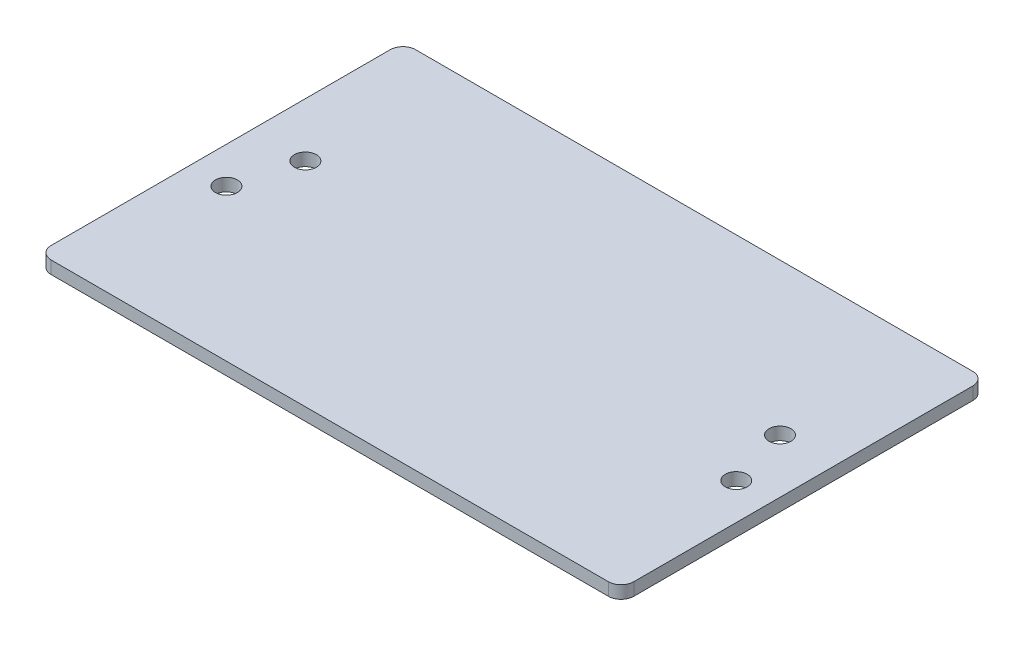
ISO-10303-21;
HEADER;
FILE_DESCRIPTION(('STEP AP214'),'2;1');
FILE_NAME('part.step','',(''),(''),'','','');
FILE_SCHEMA(('AUTOMOTIVE_DESIGN { 1 0 10303 214 1 1 1 1 }'));
ENDSEC;
DATA;
#1=APPLICATION_CONTEXT('core data for automotive mechanical design processes');
#2=APPLICATION_PROTOCOL_DEFINITION('international standard','automotive_design',2000,#1);
#3=PRODUCT_CONTEXT('',#1,'mechanical');
#4=PRODUCT('Part','Part','',(#3));
#5=PRODUCT_RELATED_PRODUCT_CATEGORY('part','',(#4));
#6=PRODUCT_DEFINITION_FORMATION('','',#4);
#7=PRODUCT_DEFINITION_CONTEXT('part definition',#1,'design');
#8=PRODUCT_DEFINITION('design','',#6,#7);
#9=PRODUCT_DEFINITION_SHAPE('','',#8);
#10=(LENGTH_UNIT() NAMED_UNIT(*) SI_UNIT(.MILLI.,.METRE.));
#11=(NAMED_UNIT(*) PLANE_ANGLE_UNIT() SI_UNIT($,.RADIAN.));
#12=(NAMED_UNIT(*) SI_UNIT($,.STERADIAN.) SOLID_ANGLE_UNIT());
#13=UNCERTAINTY_MEASURE_WITH_UNIT(LENGTH_MEASURE(1.E-05),#10,'distance_accuracy_value','');
#14=(GEOMETRIC_REPRESENTATION_CONTEXT(3) GLOBAL_UNCERTAINTY_ASSIGNED_CONTEXT((#13)) GLOBAL_UNIT_ASSIGNED_CONTEXT((#10,
#11,#12)) REPRESENTATION_CONTEXT('',''));
#15=CARTESIAN_POINT('',(0.,0.,0.));
#16=DIRECTION('',(0.,0.,1.));
#17=DIRECTION('',(1.,0.,0.));
#18=AXIS2_PLACEMENT_3D('',#15,#16,#17);
#19=CARTESIAN_POINT('',(0.,3.175,0.));
#20=DIRECTION('',(0.,-1.,0.));
#21=DIRECTION('',(0.,0.,-1.));
#22=AXIS2_PLACEMENT_3D('',#19,#20,#21);
#23=PLANE('',#22);
#24=DIRECTION('',(0.,0.,1.));
#25=VECTOR('',#24,1.);
#26=CARTESIAN_POINT('',(0.,3.175,0.));
#27=LINE('',#26,#25);
#28=CARTESIAN_POINT('',(0.,3.175,-88.175));
#29=VERTEX_POINT('',#28);
#30=CARTESIAN_POINT('',(0.,3.175,-3.175));
#31=VERTEX_POINT('',#30);
#32=EDGE_CURVE('E154',#29,#31,#27,.T.);
#33=ORIENTED_EDGE('',*,*,#32,.T.);
#34=CARTESIAN_POINT('',(3.175,3.175,-3.175));
#35=DIRECTION('',(0.,-1.,0.));
#36=DIRECTION('',(0.,0.,-1.));
#37=AXIS2_PLACEMENT_3D('',#34,#35,#36);
#38=CIRCLE('',#37,3.175);
#39=CARTESIAN_POINT('',(3.175,3.175,0.));
#40=VERTEX_POINT('',#39);
#41=EDGE_CURVE('E178',#31,#40,#38,.F.);
#42=ORIENTED_EDGE('',*,*,#41,.T.);
#43=DIRECTION('',(1.,0.,0.));
#44=VECTOR('',#43,1.);
#45=CARTESIAN_POINT('',(0.,3.175,0.));
#46=LINE('',#45,#44);
#47=CARTESIAN_POINT('',(142.875,3.175,0.));
#48=VERTEX_POINT('',#47);
#49=EDGE_CURVE('E131',#40,#48,#46,.T.);
#50=ORIENTED_EDGE('',*,*,#49,.T.);
#51=CARTESIAN_POINT('',(142.875,3.175,-3.175));
#52=DIRECTION('',(0.,-1.,0.));
#53=DIRECTION('',(0.,0.,-1.));
#54=AXIS2_PLACEMENT_3D('',#51,#52,#53);
#55=CIRCLE('',#54,3.175);
#56=CARTESIAN_POINT('',(146.05,3.175,-3.175));
#57=VERTEX_POINT('',#56);
#58=EDGE_CURVE('E175',#48,#57,#55,.F.);
#59=ORIENTED_EDGE('',*,*,#58,.T.);
#60=DIRECTION('',(0.,0.,-1.));
#61=VECTOR('',#60,1.);
#62=CARTESIAN_POINT('',(146.05,3.175,0.));
#63=LINE('',#62,#61);
#64=CARTESIAN_POINT('',(146.05,3.175,-88.175));
#65=VERTEX_POINT('',#64);
#66=EDGE_CURVE('E190',#57,#65,#63,.T.);
#67=ORIENTED_EDGE('',*,*,#66,.T.);
#68=CARTESIAN_POINT('',(142.875,3.175,-88.175));
#69=DIRECTION('',(0.,-1.,0.));
#70=DIRECTION('',(0.,0.,-1.));
#71=AXIS2_PLACEMENT_3D('',#68,#69,#70);
#72=CIRCLE('',#71,3.175);
#73=CARTESIAN_POINT('',(142.875,3.175,-91.35));
#74=VERTEX_POINT('',#73);
#75=EDGE_CURVE('E65',#65,#74,#72,.F.);
#76=ORIENTED_EDGE('',*,*,#75,.T.);
#77=DIRECTION('',(-1.,0.,0.));
#78=VECTOR('',#77,1.);
#79=CARTESIAN_POINT('',(0.,3.175,-91.35));
#80=LINE('',#79,#78);
#81=CARTESIAN_POINT('',(3.175,3.175,-91.35));
#82=VERTEX_POINT('',#81);
#83=EDGE_CURVE('E156',#74,#82,#80,.T.);
#84=ORIENTED_EDGE('',*,*,#83,.T.);
#85=CARTESIAN_POINT('',(3.175,3.175,-88.175));
#86=DIRECTION('',(0.,-1.,0.));
#87=DIRECTION('',(0.,0.,-1.));
#88=AXIS2_PLACEMENT_3D('',#85,#86,#87);
#89=CIRCLE('',#88,3.175);
#90=EDGE_CURVE('E170',#82,#29,#89,.F.);
#91=ORIENTED_EDGE('',*,*,#90,.T.);
#92=EDGE_LOOP('',(#33,#42,#50,#59,#67,#76,#84,#91));
#93=FACE_BOUND('',#92,.T.);
#94=CARTESIAN_POINT('',(13.525,3.175,-53.3650935));
#95=DIRECTION('',(0.,1.,0.));
#96=DIRECTION('',(0.,0.,1.));
#97=AXIS2_PLACEMENT_3D('',#94,#95,#96);
#98=CIRCLE('',#97,2.75);
#99=CARTESIAN_POINT('',(13.525,3.175,-50.6150935));
#100=VERTEX_POINT('',#99);
#101=EDGE_CURVE('E148',#100,#100,#98,.T.);
#102=ORIENTED_EDGE('',*,*,#101,.F.);
#103=EDGE_LOOP('',(#102));
#104=FACE_BOUND('',#103,.T.);
#105=CARTESIAN_POINT('',(9.11480200000001,3.175,-37.9849065));
#106=DIRECTION('',(0.,1.,0.));
#107=DIRECTION('',(0.,0.,1.));
#108=AXIS2_PLACEMENT_3D('',#105,#106,#107);
#109=CIRCLE('',#108,2.75);
#110=CARTESIAN_POINT('',(9.11480200000001,3.175,-35.2349065));
#111=VERTEX_POINT('',#110);
#112=EDGE_CURVE('E203',#111,#111,#109,.T.);
#113=ORIENTED_EDGE('',*,*,#112,.F.);
#114=EDGE_LOOP('',(#113));
#115=FACE_BOUND('',#114,.T.);
#116=CARTESIAN_POINT('',(132.525,3.175,-53.3650935));
#117=DIRECTION('',(0.,1.,0.));
#118=DIRECTION('',(0.,0.,1.));
#119=AXIS2_PLACEMENT_3D('',#116,#117,#118);
#120=CIRCLE('',#119,2.75000000000001);
#121=CARTESIAN_POINT('',(132.525,3.175,-50.6150935));
#122=VERTEX_POINT('',#121);
#123=EDGE_CURVE('E211',#122,#122,#120,.T.);
#124=ORIENTED_EDGE('',*,*,#123,.F.);
#125=EDGE_LOOP('',(#124));
#126=FACE_BOUND('',#125,.T.);
#127=CARTESIAN_POINT('',(136.935198,3.175,-37.9849065));
#128=DIRECTION('',(0.,1.,0.));
#129=DIRECTION('',(0.,0.,1.));
#130=AXIS2_PLACEMENT_3D('',#127,#128,#129);
#131=CIRCLE('',#130,2.75000000000001);
#132=CARTESIAN_POINT('',(136.935198,3.175,-35.2349065));
#133=VERTEX_POINT('',#132);
#134=EDGE_CURVE('E219',#133,#133,#131,.T.);
#135=ORIENTED_EDGE('',*,*,#134,.F.);
#136=EDGE_LOOP('',(#135));
#137=FACE_BOUND('',#136,.T.);
#138=ADVANCED_FACE('F43',(#93,#104,#115,#126,#137),#23,.F.);
#139=CARTESIAN_POINT('',(0.,0.,0.));
#140=DIRECTION('',(0.,-1.,0.));
#141=DIRECTION('',(0.,0.,-1.));
#142=AXIS2_PLACEMENT_3D('',#139,#140,#141);
#143=PLANE('',#142);
#144=CARTESIAN_POINT('',(132.525,0.,-53.3650935));
#145=DIRECTION('',(0.,1.,0.));
#146=DIRECTION('',(0.,0.,1.));
#147=AXIS2_PLACEMENT_3D('',#144,#145,#146);
#148=CIRCLE('',#147,2.75000000000001);
#149=CARTESIAN_POINT('',(132.525,0.,-50.6150935));
#150=VERTEX_POINT('',#149);
#151=EDGE_CURVE('E215',#150,#150,#148,.T.);
#152=ORIENTED_EDGE('',*,*,#151,.T.);
#153=EDGE_LOOP('',(#152));
#154=FACE_BOUND('',#153,.T.);
#155=CARTESIAN_POINT('',(13.525,0.,-53.3650935));
#156=DIRECTION('',(0.,1.,0.));
#157=DIRECTION('',(0.,0.,1.));
#158=AXIS2_PLACEMENT_3D('',#155,#156,#157);
#159=CIRCLE('',#158,2.75);
#160=CARTESIAN_POINT('',(13.525,0.,-50.6150935));
#161=VERTEX_POINT('',#160);
#162=EDGE_CURVE('E199',#161,#161,#159,.T.);
#163=ORIENTED_EDGE('',*,*,#162,.T.);
#164=EDGE_LOOP('',(#163));
#165=FACE_BOUND('',#164,.T.);
#166=DIRECTION('',(1.,0.,0.));
#167=VECTOR('',#166,1.);
#168=CARTESIAN_POINT('',(0.,0.,0.));
#169=LINE('',#168,#167);
#170=CARTESIAN_POINT('',(3.175,0.,0.));
#171=VERTEX_POINT('',#170);
#172=CARTESIAN_POINT('',(142.875,0.,0.));
#173=VERTEX_POINT('',#172);
#174=EDGE_CURVE('E128',#171,#173,#169,.T.);
#175=ORIENTED_EDGE('',*,*,#174,.F.);
#176=CARTESIAN_POINT('',(3.175,0.,-3.175));
#177=DIRECTION('',(0.,-1.,0.));
#178=DIRECTION('',(0.,0.,-1.));
#179=AXIS2_PLACEMENT_3D('',#176,#177,#178);
#180=CIRCLE('',#179,3.175);
#181=CARTESIAN_POINT('',(0.,0.,-3.175));
#182=VERTEX_POINT('',#181);
#183=EDGE_CURVE('E110',#171,#182,#180,.T.);
#184=ORIENTED_EDGE('',*,*,#183,.T.);
#185=DIRECTION('',(0.,0.,1.));
#186=VECTOR('',#185,1.);
#187=CARTESIAN_POINT('',(0.,0.,0.));
#188=LINE('',#187,#186);
#189=CARTESIAN_POINT('',(0.,0.,-88.175));
#190=VERTEX_POINT('',#189);
#191=EDGE_CURVE('E141',#190,#182,#188,.T.);
#192=ORIENTED_EDGE('',*,*,#191,.F.);
#193=CARTESIAN_POINT('',(3.175,0.,-88.175));
#194=DIRECTION('',(0.,-1.,0.));
#195=DIRECTION('',(0.,0.,-1.));
#196=AXIS2_PLACEMENT_3D('',#193,#194,#195);
#197=CIRCLE('',#196,3.175);
#198=CARTESIAN_POINT('',(3.175,0.,-91.35));
#199=VERTEX_POINT('',#198);
#200=EDGE_CURVE('E133',#190,#199,#197,.T.);
#201=ORIENTED_EDGE('',*,*,#200,.T.);
#202=DIRECTION('',(-1.,0.,0.));
#203=VECTOR('',#202,1.);
#204=CARTESIAN_POINT('',(0.,0.,-91.35));
#205=LINE('',#204,#203);
#206=CARTESIAN_POINT('',(142.875,0.,-91.35));
#207=VERTEX_POINT('',#206);
#208=EDGE_CURVE('E146',#207,#199,#205,.T.);
#209=ORIENTED_EDGE('',*,*,#208,.F.);
#210=CARTESIAN_POINT('',(142.875,0.,-88.175));
#211=DIRECTION('',(0.,-1.,0.));
#212=DIRECTION('',(0.,0.,-1.));
#213=AXIS2_PLACEMENT_3D('',#210,#211,#212);
#214=CIRCLE('',#213,3.175);
#215=CARTESIAN_POINT('',(146.05,0.,-88.175));
#216=VERTEX_POINT('',#215);
#217=EDGE_CURVE('E160',#207,#216,#214,.T.);
#218=ORIENTED_EDGE('',*,*,#217,.T.);
#219=DIRECTION('',(0.,0.,-1.));
#220=VECTOR('',#219,1.);
#221=CARTESIAN_POINT('',(146.05,0.,0.));
#222=LINE('',#221,#220);
#223=CARTESIAN_POINT('',(146.05,0.,-3.175));
#224=VERTEX_POINT('',#223);
#225=EDGE_CURVE('E140',#224,#216,#222,.T.);
#226=ORIENTED_EDGE('',*,*,#225,.F.);
#227=CARTESIAN_POINT('',(142.875,0.,-3.175));
#228=DIRECTION('',(0.,-1.,0.));
#229=DIRECTION('',(0.,0.,-1.));
#230=AXIS2_PLACEMENT_3D('',#227,#228,#229);
#231=CIRCLE('',#230,3.175);
#232=EDGE_CURVE('E122',#224,#173,#231,.T.);
#233=ORIENTED_EDGE('',*,*,#232,.T.);
#234=EDGE_LOOP('',(#175,#184,#192,#201,#209,#218,#226,#233));
#235=FACE_BOUND('',#234,.T.);
#236=CARTESIAN_POINT('',(9.11480200000001,0.,-37.9849065));
#237=DIRECTION('',(0.,1.,0.));
#238=DIRECTION('',(0.,0.,1.));
#239=AXIS2_PLACEMENT_3D('',#236,#237,#238);
#240=CIRCLE('',#239,2.75);
#241=CARTESIAN_POINT('',(9.11480200000001,0.,-35.2349065));
#242=VERTEX_POINT('',#241);
#243=EDGE_CURVE('E207',#242,#242,#240,.T.);
#244=ORIENTED_EDGE('',*,*,#243,.T.);
#245=EDGE_LOOP('',(#244));
#246=FACE_BOUND('',#245,.T.);
#247=CARTESIAN_POINT('',(136.935198,0.,-37.9849065));
#248=DIRECTION('',(0.,1.,0.));
#249=DIRECTION('',(0.,0.,1.));
#250=AXIS2_PLACEMENT_3D('',#247,#248,#249);
#251=CIRCLE('',#250,2.75000000000001);
#252=CARTESIAN_POINT('',(136.935198,0.,-35.2349065));
#253=VERTEX_POINT('',#252);
#254=EDGE_CURVE('E223',#253,#253,#251,.T.);
#255=ORIENTED_EDGE('',*,*,#254,.T.);
#256=EDGE_LOOP('',(#255));
#257=FACE_BOUND('',#256,.T.);
#258=ADVANCED_FACE('F136',(#154,#165,#235,#246,#257),#143,.T.);
#259=CARTESIAN_POINT('',(0.,3.175,0.));
#260=DIRECTION('',(1.,0.,0.));
#261=DIRECTION('',(0.,0.,-1.));
#262=AXIS2_PLACEMENT_3D('',#259,#260,#261);
#263=PLANE('',#262);
#264=ORIENTED_EDGE('',*,*,#191,.T.);
#265=DIRECTION('',(0.,-1.,0.));
#266=VECTOR('',#265,1.);
#267=CARTESIAN_POINT('',(0.,3.175,-3.175));
#268=LINE('',#267,#266);
#269=EDGE_CURVE('E115',#182,#31,#268,.F.);
#270=ORIENTED_EDGE('',*,*,#269,.T.);
#271=ORIENTED_EDGE('',*,*,#32,.F.);
#272=DIRECTION('',(0.,-1.,0.));
#273=VECTOR('',#272,1.);
#274=CARTESIAN_POINT('',(0.,3.175,-88.175));
#275=LINE('',#274,#273);
#276=EDGE_CURVE('E121',#29,#190,#275,.T.);
#277=ORIENTED_EDGE('',*,*,#276,.T.);
#278=EDGE_LOOP('',(#264,#270,#271,#277));
#279=FACE_BOUND('',#278,.T.);
#280=ADVANCED_FACE('F239',(#279),#263,.F.);
#281=CARTESIAN_POINT('',(0.,3.175,0.));
#282=DIRECTION('',(0.,0.,-1.));
#283=DIRECTION('',(-1.,0.,0.));
#284=AXIS2_PLACEMENT_3D('',#281,#282,#283);
#285=PLANE('',#284);
#286=ORIENTED_EDGE('',*,*,#49,.F.);
#287=DIRECTION('',(0.,-1.,0.));
#288=VECTOR('',#287,1.);
#289=CARTESIAN_POINT('',(3.175,3.175,0.));
#290=LINE('',#289,#288);
#291=EDGE_CURVE('E114',#40,#171,#290,.T.);
#292=ORIENTED_EDGE('',*,*,#291,.T.);
#293=ORIENTED_EDGE('',*,*,#174,.T.);
#294=DIRECTION('',(0.,-1.,0.));
#295=VECTOR('',#294,1.);
#296=CARTESIAN_POINT('',(142.875,3.175,0.));
#297=LINE('',#296,#295);
#298=EDGE_CURVE('E134',#173,#48,#297,.F.);
#299=ORIENTED_EDGE('',*,*,#298,.T.);
#300=EDGE_LOOP('',(#286,#292,#293,#299));
#301=FACE_BOUND('',#300,.T.);
#302=ADVANCED_FACE('F127',(#301),#285,.F.);
#303=CARTESIAN_POINT('',(146.05,3.175,0.));
#304=DIRECTION('',(-1.,0.,0.));
#305=DIRECTION('',(0.,0.,1.));
#306=AXIS2_PLACEMENT_3D('',#303,#304,#305);
#307=PLANE('',#306);
#308=ORIENTED_EDGE('',*,*,#66,.F.);
#309=DIRECTION('',(0.,-1.,0.));
#310=VECTOR('',#309,1.);
#311=CARTESIAN_POINT('',(146.05,3.175,-3.175));
#312=LINE('',#311,#310);
#313=EDGE_CURVE('E184',#57,#224,#312,.T.);
#314=ORIENTED_EDGE('',*,*,#313,.T.);
#315=ORIENTED_EDGE('',*,*,#225,.T.);
#316=DIRECTION('',(0.,-1.,0.));
#317=VECTOR('',#316,1.);
#318=CARTESIAN_POINT('',(146.05,3.175,-88.175));
#319=LINE('',#318,#317);
#320=EDGE_CURVE('E181',#216,#65,#319,.F.);
#321=ORIENTED_EDGE('',*,*,#320,.T.);
#322=EDGE_LOOP('',(#308,#314,#315,#321));
#323=FACE_BOUND('',#322,.T.);
#324=ADVANCED_FACE('F250',(#323),#307,.F.);
#325=CARTESIAN_POINT('',(0.,3.175,-91.35));
#326=DIRECTION('',(0.,0.,1.));
#327=DIRECTION('',(1.,0.,0.));
#328=AXIS2_PLACEMENT_3D('',#325,#326,#327);
#329=PLANE('',#328);
#330=ORIENTED_EDGE('',*,*,#83,.F.);
#331=DIRECTION('',(0.,-1.,0.));
#332=VECTOR('',#331,1.);
#333=CARTESIAN_POINT('',(142.875,3.175,-91.35));
#334=LINE('',#333,#332);
#335=EDGE_CURVE('E11',#74,#207,#334,.T.);
#336=ORIENTED_EDGE('',*,*,#335,.T.);
#337=ORIENTED_EDGE('',*,*,#208,.T.);
#338=DIRECTION('',(0.,-1.,0.));
#339=VECTOR('',#338,1.);
#340=CARTESIAN_POINT('',(3.175,3.175,-91.35));
#341=LINE('',#340,#339);
#342=EDGE_CURVE('E52',#199,#82,#341,.F.);
#343=ORIENTED_EDGE('',*,*,#342,.T.);
#344=EDGE_LOOP('',(#330,#336,#337,#343));
#345=FACE_BOUND('',#344,.T.);
#346=ADVANCED_FACE('F247',(#345),#329,.F.);
#347=CARTESIAN_POINT('',(13.525,3.175,-53.3650935));
#348=DIRECTION('',(0.,-1.,0.));
#349=DIRECTION('',(0.,0.,-1.));
#350=AXIS2_PLACEMENT_3D('',#347,#348,#349);
#351=CYLINDRICAL_SURFACE('',#350,2.75);
#352=ORIENTED_EDGE('',*,*,#101,.T.);
#353=EDGE_LOOP('',(#352));
#354=FACE_BOUND('',#353,.T.);
#355=ORIENTED_EDGE('',*,*,#162,.F.);
#356=EDGE_LOOP('',(#355));
#357=FACE_BOUND('',#356,.T.);
#358=ADVANCED_FACE('F244',(#354,#357),#351,.F.);
#359=CARTESIAN_POINT('',(9.11480200000001,3.175,-37.9849065));
#360=DIRECTION('',(0.,-1.,0.));
#361=DIRECTION('',(0.,0.,-1.));
#362=AXIS2_PLACEMENT_3D('',#359,#360,#361);
#363=CYLINDRICAL_SURFACE('',#362,2.75);
#364=ORIENTED_EDGE('',*,*,#112,.T.);
#365=EDGE_LOOP('',(#364));
#366=FACE_BOUND('',#365,.T.);
#367=ORIENTED_EDGE('',*,*,#243,.F.);
#368=EDGE_LOOP('',(#367));
#369=FACE_BOUND('',#368,.T.);
#370=ADVANCED_FACE('F362',(#366,#369),#363,.F.);
#371=CARTESIAN_POINT('',(132.525,3.175,-53.3650935));
#372=DIRECTION('',(0.,-1.,0.));
#373=DIRECTION('',(0.,0.,-1.));
#374=AXIS2_PLACEMENT_3D('',#371,#372,#373);
#375=CYLINDRICAL_SURFACE('',#374,2.75000000000001);
#376=ORIENTED_EDGE('',*,*,#123,.T.);
#377=EDGE_LOOP('',(#376));
#378=FACE_BOUND('',#377,.T.);
#379=ORIENTED_EDGE('',*,*,#151,.F.);
#380=EDGE_LOOP('',(#379));
#381=FACE_BOUND('',#380,.T.);
#382=ADVANCED_FACE('F352',(#378,#381),#375,.F.);
#383=CARTESIAN_POINT('',(136.935198,3.175,-37.9849065));
#384=DIRECTION('',(0.,-1.,0.));
#385=DIRECTION('',(0.,0.,-1.));
#386=AXIS2_PLACEMENT_3D('',#383,#384,#385);
#387=CYLINDRICAL_SURFACE('',#386,2.75000000000001);
#388=ORIENTED_EDGE('',*,*,#134,.T.);
#389=EDGE_LOOP('',(#388));
#390=FACE_BOUND('',#389,.T.);
#391=ORIENTED_EDGE('',*,*,#254,.F.);
#392=EDGE_LOOP('',(#391));
#393=FACE_BOUND('',#392,.T.);
#394=ADVANCED_FACE('F231',(#390,#393),#387,.F.);
#395=CARTESIAN_POINT('',(3.175,3.175,-3.175));
#396=DIRECTION('',(0.,-1.,0.));
#397=DIRECTION('',(0.,0.,-1.));
#398=AXIS2_PLACEMENT_3D('',#395,#396,#397);
#399=CYLINDRICAL_SURFACE('',#398,3.175);
#400=ORIENTED_EDGE('',*,*,#41,.F.);
#401=ORIENTED_EDGE('',*,*,#269,.F.);
#402=ORIENTED_EDGE('',*,*,#183,.F.);
#403=ORIENTED_EDGE('',*,*,#291,.F.);
#404=EDGE_LOOP('',(#400,#401,#402,#403));
#405=FACE_BOUND('',#404,.T.);
#406=ADVANCED_FACE('F113',(#405),#399,.T.);
#407=CARTESIAN_POINT('',(142.875,3.175,-3.175));
#408=DIRECTION('',(0.,-1.,0.));
#409=DIRECTION('',(0.,0.,-1.));
#410=AXIS2_PLACEMENT_3D('',#407,#408,#409);
#411=CYLINDRICAL_SURFACE('',#410,3.175);
#412=ORIENTED_EDGE('',*,*,#58,.F.);
#413=ORIENTED_EDGE('',*,*,#298,.F.);
#414=ORIENTED_EDGE('',*,*,#232,.F.);
#415=ORIENTED_EDGE('',*,*,#313,.F.);
#416=EDGE_LOOP('',(#412,#413,#414,#415));
#417=FACE_BOUND('',#416,.T.);
#418=ADVANCED_FACE('F261',(#417),#411,.T.);
#419=CARTESIAN_POINT('',(142.875,3.175,-88.175));
#420=DIRECTION('',(0.,-1.,0.));
#421=DIRECTION('',(0.,0.,-1.));
#422=AXIS2_PLACEMENT_3D('',#419,#420,#421);
#423=CYLINDRICAL_SURFACE('',#422,3.175);
#424=ORIENTED_EDGE('',*,*,#75,.F.);
#425=ORIENTED_EDGE('',*,*,#320,.F.);
#426=ORIENTED_EDGE('',*,*,#217,.F.);
#427=ORIENTED_EDGE('',*,*,#335,.F.);
#428=EDGE_LOOP('',(#424,#425,#426,#427));
#429=FACE_BOUND('',#428,.T.);
#430=ADVANCED_FACE('F263',(#429),#423,.T.);
#431=CARTESIAN_POINT('',(3.175,3.175,-88.175));
#432=DIRECTION('',(0.,-1.,0.));
#433=DIRECTION('',(0.,0.,-1.));
#434=AXIS2_PLACEMENT_3D('',#431,#432,#433);
#435=CYLINDRICAL_SURFACE('',#434,3.175);
#436=ORIENTED_EDGE('',*,*,#90,.F.);
#437=ORIENTED_EDGE('',*,*,#342,.F.);
#438=ORIENTED_EDGE('',*,*,#200,.F.);
#439=ORIENTED_EDGE('',*,*,#276,.F.);
#440=EDGE_LOOP('',(#436,#437,#438,#439));
#441=FACE_BOUND('',#440,.T.);
#442=ADVANCED_FACE('F45',(#441),#435,.T.);
#443=CLOSED_SHELL('',(#138,#258,#280,#302,#324,#346,#358,#370,#382,#394,#406,#418,#430,#442));
#444=MANIFOLD_SOLID_BREP('B2',#443);
#445=ADVANCED_BREP_SHAPE_REPRESENTATION('',(#18,#444),#14);
#446=SHAPE_DEFINITION_REPRESENTATION(#9,#445);
ENDSEC;
END-ISO-10303-21;
